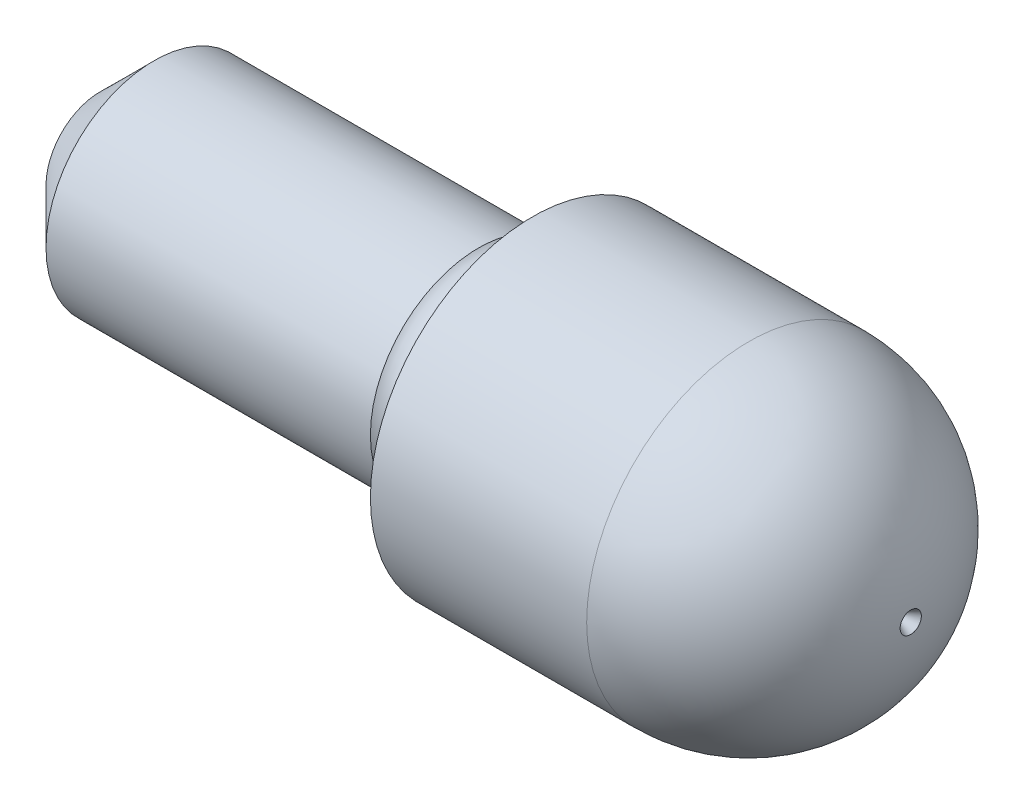
ISO-10303-21;
HEADER;
FILE_DESCRIPTION(('STEP AP214'),'2;1');
FILE_NAME('part.step','',(''),(''),'','','');
FILE_SCHEMA(('AUTOMOTIVE_DESIGN { 1 0 10303 214 1 1 1 1 }'));
ENDSEC;
DATA;
#1=APPLICATION_CONTEXT('core data for automotive mechanical design processes');
#2=APPLICATION_PROTOCOL_DEFINITION('international standard','automotive_design',2000,#1);
#3=PRODUCT_CONTEXT('',#1,'mechanical');
#4=PRODUCT('Part','Part','',(#3));
#5=PRODUCT_RELATED_PRODUCT_CATEGORY('part','',(#4));
#6=PRODUCT_DEFINITION_FORMATION('','',#4);
#7=PRODUCT_DEFINITION_CONTEXT('part definition',#1,'design');
#8=PRODUCT_DEFINITION('design','',#6,#7);
#9=PRODUCT_DEFINITION_SHAPE('','',#8);
#10=(LENGTH_UNIT() NAMED_UNIT(*) SI_UNIT(.MILLI.,.METRE.));
#11=(NAMED_UNIT(*) PLANE_ANGLE_UNIT() SI_UNIT($,.RADIAN.));
#12=(NAMED_UNIT(*) SI_UNIT($,.STERADIAN.) SOLID_ANGLE_UNIT());
#13=UNCERTAINTY_MEASURE_WITH_UNIT(LENGTH_MEASURE(1.E-05),#10,'distance_accuracy_value','');
#14=(GEOMETRIC_REPRESENTATION_CONTEXT(3) GLOBAL_UNCERTAINTY_ASSIGNED_CONTEXT((#13)) GLOBAL_UNIT_ASSIGNED_CONTEXT((#10,
#11,#12)) REPRESENTATION_CONTEXT('',''));
#15=CARTESIAN_POINT('',(0.,0.,0.));
#16=DIRECTION('',(0.,0.,1.));
#17=DIRECTION('',(1.,0.,0.));
#18=AXIS2_PLACEMENT_3D('',#15,#16,#17);
#19=CARTESIAN_POINT('',(2.,0.,0.));
#20=DIRECTION('',(-1.,0.,0.));
#21=DIRECTION('',(0.,1.,0.));
#22=AXIS2_PLACEMENT_3D('',#19,#20,#21);
#23=SPHERICAL_SURFACE('',#22,1.5);
#24=CARTESIAN_POINT('',(3.49678579004523,0.,0.));
#25=DIRECTION('',(-1.,0.,0.));
#26=DIRECTION('',(0.,0.,1.));
#27=AXIS2_PLACEMENT_3D('',#24,#25,#26);
#28=CIRCLE('',#27,0.0981442750173834);
#29=CARTESIAN_POINT('',(3.49678579004523,0.,0.0981442750173834));
#30=VERTEX_POINT('',#29);
#31=EDGE_CURVE('E11',#30,#30,#28,.T.);
#32=ORIENTED_EDGE('',*,*,#31,.T.);
#33=EDGE_LOOP('',(#32));
#34=FACE_BOUND('',#33,.T.);
#35=CARTESIAN_POINT('',(2.,0.,0.));
#36=DIRECTION('',(-1.,0.,0.));
#37=DIRECTION('',(0.,0.,1.));
#38=AXIS2_PLACEMENT_3D('',#35,#36,#37);
#39=CIRCLE('',#38,1.5);
#40=CARTESIAN_POINT('',(2.,0.,1.5));
#41=VERTEX_POINT('',#40);
#42=EDGE_CURVE('E60',#41,#41,#39,.T.);
#43=ORIENTED_EDGE('',*,*,#42,.F.);
#44=EDGE_LOOP('',(#43));
#45=FACE_BOUND('',#44,.T.);
#46=ADVANCED_FACE('F37',(#34,#45),#23,.T.);
#47=CARTESIAN_POINT('',(3.49678579004523,0.,0.));
#48=DIRECTION('',(1.,0.,0.));
#49=DIRECTION('',(0.,0.,-1.));
#50=AXIS2_PLACEMENT_3D('',#47,#48,#49);
#51=CONICAL_SURFACE('',#50,0.0981442750173834,0.523598775598287);
#52=CARTESIAN_POINT('',(3.3267949192431,0.,0.));
#53=VERTEX_POINT('',#52);
#54=VERTEX_LOOP('',#53);
#55=FACE_BOUND('',#54,.T.);
#56=ORIENTED_EDGE('',*,*,#31,.F.);
#57=EDGE_LOOP('',(#56));
#58=FACE_BOUND('',#57,.T.);
#59=ADVANCED_FACE('F50',(#55,#58),#51,.F.);
#60=CARTESIAN_POINT('',(-3.8267949192431,0.,0.));
#61=DIRECTION('',(-1.,0.,0.));
#62=DIRECTION('',(0.,0.,1.));
#63=AXIS2_PLACEMENT_3D('',#60,#61,#62);
#64=CONICAL_SURFACE('',#63,0.,0.523598775598285);
#65=CARTESIAN_POINT('',(-4.,0.,0.));
#66=DIRECTION('',(-1.,0.,0.));
#67=DIRECTION('',(0.,0.,1.));
#68=AXIS2_PLACEMENT_3D('',#65,#66,#67);
#69=CIRCLE('',#68,0.100000000000007);
#70=CARTESIAN_POINT('',(-4.,0.,0.100000000000007));
#71=VERTEX_POINT('',#70);
#72=EDGE_CURVE('E44',#71,#71,#69,.T.);
#73=ORIENTED_EDGE('',*,*,#72,.T.);
#74=EDGE_LOOP('',(#73));
#75=FACE_BOUND('',#74,.T.);
#76=CARTESIAN_POINT('',(-3.8267949192431,0.,0.));
#77=VERTEX_POINT('',#76);
#78=VERTEX_LOOP('',#77);
#79=FACE_BOUND('',#78,.T.);
#80=ADVANCED_FACE('F53',(#75,#79),#64,.F.);
#81=CARTESIAN_POINT('',(-4.,0.100000000000007,0.));
#82=DIRECTION('',(-1.,0.,0.));
#83=DIRECTION('',(0.,0.,1.));
#84=AXIS2_PLACEMENT_3D('',#81,#82,#83);
#85=PLANE('',#84);
#86=CARTESIAN_POINT('',(-4.,0.,0.));
#87=DIRECTION('',(-1.,0.,0.));
#88=DIRECTION('',(0.,0.,1.));
#89=AXIS2_PLACEMENT_3D('',#86,#87,#88);
#90=CIRCLE('',#89,0.5);
#91=CARTESIAN_POINT('',(-4.,0.,0.5));
#92=VERTEX_POINT('',#91);
#93=EDGE_CURVE('E82',#92,#92,#90,.T.);
#94=ORIENTED_EDGE('',*,*,#93,.T.);
#95=EDGE_LOOP('',(#94));
#96=FACE_BOUND('',#95,.T.);
#97=ORIENTED_EDGE('',*,*,#72,.F.);
#98=EDGE_LOOP('',(#97));
#99=FACE_BOUND('',#98,.T.);
#100=ADVANCED_FACE('F88',(#96,#99),#85,.T.);
#101=CARTESIAN_POINT('',(-4.,0.,0.));
#102=DIRECTION('',(1.,0.,0.));
#103=DIRECTION('',(0.,0.,-1.));
#104=AXIS2_PLACEMENT_3D('',#101,#102,#103);
#105=CONICAL_SURFACE('',#104,0.5,0.785398163397447);
#106=CARTESIAN_POINT('',(-3.5,0.,0.));
#107=DIRECTION('',(-1.,0.,0.));
#108=DIRECTION('',(0.,0.,1.));
#109=AXIS2_PLACEMENT_3D('',#106,#107,#108);
#110=CIRCLE('',#109,0.999999999999999);
#111=CARTESIAN_POINT('',(-3.5,0.,0.999999999999999));
#112=VERTEX_POINT('',#111);
#113=EDGE_CURVE('E79',#112,#112,#110,.T.);
#114=ORIENTED_EDGE('',*,*,#113,.T.);
#115=EDGE_LOOP('',(#114));
#116=FACE_BOUND('',#115,.T.);
#117=ORIENTED_EDGE('',*,*,#93,.F.);
#118=EDGE_LOOP('',(#117));
#119=FACE_BOUND('',#118,.T.);
#120=ADVANCED_FACE('F90',(#116,#119),#105,.T.);
#121=CARTESIAN_POINT('',(3.50154288478932,0.,0.));
#122=DIRECTION('',(-1.,0.,0.));
#123=DIRECTION('',(0.,0.,1.));
#124=AXIS2_PLACEMENT_3D('',#121,#122,#123);
#125=CYLINDRICAL_SURFACE('',#124,1.);
#126=CARTESIAN_POINT('',(-0.5,0.,0.));
#127=DIRECTION('',(-1.,0.,0.));
#128=DIRECTION('',(0.,0.,1.));
#129=AXIS2_PLACEMENT_3D('',#126,#127,#128);
#130=CIRCLE('',#129,1.);
#131=CARTESIAN_POINT('',(-0.5,0.,1.));
#132=VERTEX_POINT('',#131);
#133=EDGE_CURVE('E76',#132,#132,#130,.T.);
#134=ORIENTED_EDGE('',*,*,#133,.T.);
#135=EDGE_LOOP('',(#134));
#136=FACE_BOUND('',#135,.T.);
#137=ORIENTED_EDGE('',*,*,#113,.F.);
#138=EDGE_LOOP('',(#137));
#139=FACE_BOUND('',#138,.T.);
#140=ADVANCED_FACE('F97',(#136,#139),#125,.T.);
#141=CARTESIAN_POINT('',(-0.367712434446794,0.,0.));
#142=DIRECTION('',(-1.,0.,0.));
#143=DIRECTION('',(0.,0.,1.));
#144=AXIS2_PLACEMENT_3D('',#141,#142,#143);
#145=TOROIDAL_SURFACE('',#144,1.14999999999994,0.199999999999936);
#146=CARTESIAN_POINT('',(-0.367712434446769,0.,0.));
#147=DIRECTION('',(-1.,0.,0.));
#148=DIRECTION('',(0.,0.,1.));
#149=AXIS2_PLACEMENT_3D('',#146,#147,#148);
#150=CIRCLE('',#149,0.95);
#151=CARTESIAN_POINT('',(-0.367712434446769,0.,0.95));
#152=VERTEX_POINT('',#151);
#153=EDGE_CURVE('E73',#152,#152,#150,.T.);
#154=ORIENTED_EDGE('',*,*,#153,.T.);
#155=EDGE_LOOP('',(#154));
#156=FACE_BOUND('',#155,.T.);
#157=ORIENTED_EDGE('',*,*,#133,.F.);
#158=EDGE_LOOP('',(#157));
#159=FACE_BOUND('',#158,.T.);
#160=ADVANCED_FACE('F104',(#156,#159),#145,.F.);
#161=CARTESIAN_POINT('',(3.50154288478932,0.,0.));
#162=DIRECTION('',(-1.,0.,0.));
#163=DIRECTION('',(0.,0.,1.));
#164=AXIS2_PLACEMENT_3D('',#161,#162,#163);
#165=CYLINDRICAL_SURFACE('',#164,0.95);
#166=CARTESIAN_POINT('',(-0.199999999999999,0.,0.));
#167=DIRECTION('',(-1.,0.,0.));
#168=DIRECTION('',(0.,0.,1.));
#169=AXIS2_PLACEMENT_3D('',#166,#167,#168);
#170=CIRCLE('',#169,0.95);
#171=CARTESIAN_POINT('',(-0.199999999999999,0.,0.95));
#172=VERTEX_POINT('',#171);
#173=EDGE_CURVE('E70',#172,#172,#170,.T.);
#174=ORIENTED_EDGE('',*,*,#173,.T.);
#175=EDGE_LOOP('',(#174));
#176=FACE_BOUND('',#175,.T.);
#177=ORIENTED_EDGE('',*,*,#153,.F.);
#178=EDGE_LOOP('',(#177));
#179=FACE_BOUND('',#178,.T.);
#180=ADVANCED_FACE('F108',(#176,#179),#165,.T.);
#181=CARTESIAN_POINT('',(-0.200000000000017,0.,0.));
#182=DIRECTION('',(-1.,0.,0.));
#183=DIRECTION('',(0.,0.,1.));
#184=AXIS2_PLACEMENT_3D('',#181,#182,#183);
#185=TOROIDAL_SURFACE('',#184,1.15000000000002,0.200000000000017);
#186=CARTESIAN_POINT('',(0.,0.,0.));
#187=DIRECTION('',(-1.,0.,0.));
#188=DIRECTION('',(0.,0.,1.));
#189=AXIS2_PLACEMENT_3D('',#186,#187,#188);
#190=CIRCLE('',#189,1.15000000000002);
#191=CARTESIAN_POINT('',(0.,0.,1.15000000000002));
#192=VERTEX_POINT('',#191);
#193=EDGE_CURVE('E65',#192,#192,#190,.T.);
#194=ORIENTED_EDGE('',*,*,#193,.T.);
#195=EDGE_LOOP('',(#194));
#196=FACE_BOUND('',#195,.T.);
#197=ORIENTED_EDGE('',*,*,#173,.F.);
#198=EDGE_LOOP('',(#197));
#199=FACE_BOUND('',#198,.T.);
#200=ADVANCED_FACE('F112',(#196,#199),#185,.F.);
#201=CARTESIAN_POINT('',(0.,1.15000000000002,0.));
#202=DIRECTION('',(-1.,0.,0.));
#203=DIRECTION('',(0.,0.,1.));
#204=AXIS2_PLACEMENT_3D('',#201,#202,#203);
#205=PLANE('',#204);
#206=CARTESIAN_POINT('',(0.,0.,0.));
#207=DIRECTION('',(-1.,0.,0.));
#208=DIRECTION('',(0.,0.,1.));
#209=AXIS2_PLACEMENT_3D('',#206,#207,#208);
#210=CIRCLE('',#209,1.5);
#211=CARTESIAN_POINT('',(0.,0.,1.5));
#212=VERTEX_POINT('',#211);
#213=EDGE_CURVE('E62',#212,#212,#210,.T.);
#214=ORIENTED_EDGE('',*,*,#213,.T.);
#215=EDGE_LOOP('',(#214));
#216=FACE_BOUND('',#215,.T.);
#217=ORIENTED_EDGE('',*,*,#193,.F.);
#218=EDGE_LOOP('',(#217));
#219=FACE_BOUND('',#218,.T.);
#220=ADVANCED_FACE('F116',(#216,#219),#205,.T.);
#221=CARTESIAN_POINT('',(3.50154288478932,0.,0.));
#222=DIRECTION('',(-1.,0.,0.));
#223=DIRECTION('',(0.,0.,1.));
#224=AXIS2_PLACEMENT_3D('',#221,#222,#223);
#225=CYLINDRICAL_SURFACE('',#224,1.5);
#226=ORIENTED_EDGE('',*,*,#42,.T.);
#227=EDGE_LOOP('',(#226));
#228=FACE_BOUND('',#227,.T.);
#229=ORIENTED_EDGE('',*,*,#213,.F.);
#230=EDGE_LOOP('',(#229));
#231=FACE_BOUND('',#230,.T.);
#232=ADVANCED_FACE('F120',(#228,#231),#225,.T.);
#233=CLOSED_SHELL('',(#46,#59,#80,#100,#120,#140,#160,#180,#200,#220,#232));
#234=MANIFOLD_SOLID_BREP('B2',#233);
#235=ADVANCED_BREP_SHAPE_REPRESENTATION('',(#18,#234),#14);
#236=SHAPE_DEFINITION_REPRESENTATION(#9,#235);
ENDSEC;
END-ISO-10303-21;
